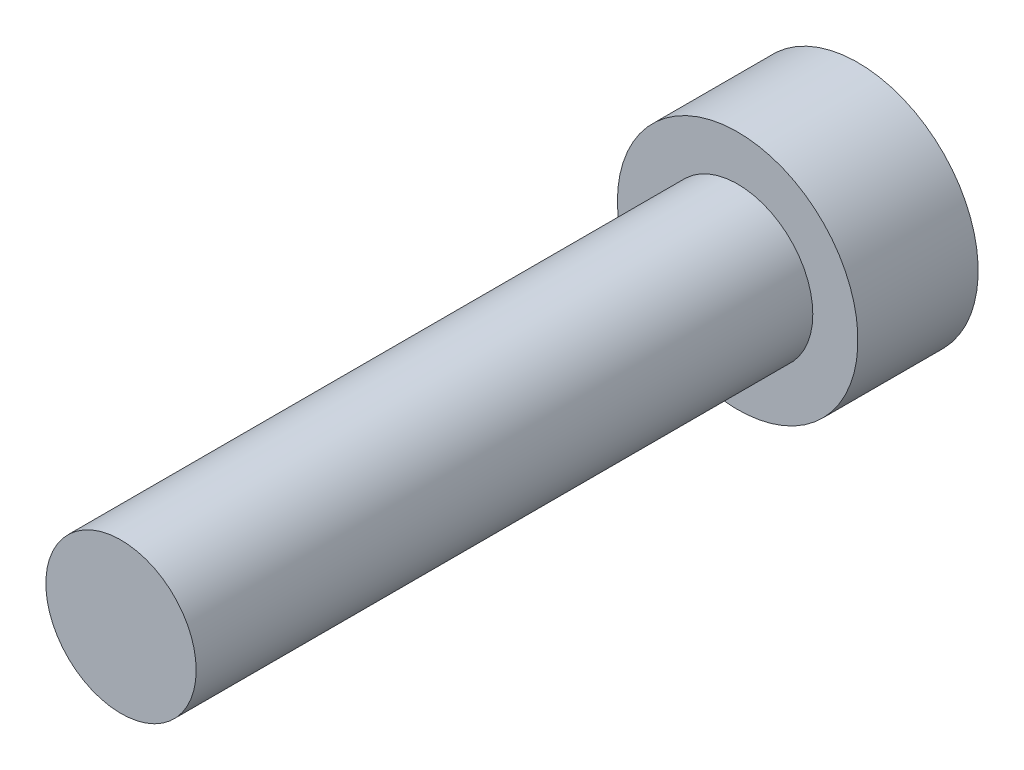
ISO-10303-21;
HEADER;
FILE_DESCRIPTION(('STEP AP214'),'2;1');
FILE_NAME('part.step','',(''),(''),'','','');
FILE_SCHEMA(('AUTOMOTIVE_DESIGN { 1 0 10303 214 1 1 1 1 }'));
ENDSEC;
DATA;
#1=APPLICATION_CONTEXT('core data for automotive mechanical design processes');
#2=APPLICATION_PROTOCOL_DEFINITION('international standard','automotive_design',2000,#1);
#3=PRODUCT_CONTEXT('',#1,'mechanical');
#4=PRODUCT('Part','Part','',(#3));
#5=PRODUCT_RELATED_PRODUCT_CATEGORY('part','',(#4));
#6=PRODUCT_DEFINITION_FORMATION('','',#4);
#7=PRODUCT_DEFINITION_CONTEXT('part definition',#1,'design');
#8=PRODUCT_DEFINITION('design','',#6,#7);
#9=PRODUCT_DEFINITION_SHAPE('','',#8);
#10=(LENGTH_UNIT() NAMED_UNIT(*) SI_UNIT(.MILLI.,.METRE.));
#11=(NAMED_UNIT(*) PLANE_ANGLE_UNIT() SI_UNIT($,.RADIAN.));
#12=(NAMED_UNIT(*) SI_UNIT($,.STERADIAN.) SOLID_ANGLE_UNIT());
#13=UNCERTAINTY_MEASURE_WITH_UNIT(LENGTH_MEASURE(1.E-05),#10,'distance_accuracy_value','');
#14=(GEOMETRIC_REPRESENTATION_CONTEXT(3) GLOBAL_UNCERTAINTY_ASSIGNED_CONTEXT((#13)) GLOBAL_UNIT_ASSIGNED_CONTEXT((#10,
#11,#12)) REPRESENTATION_CONTEXT('',''));
#15=CARTESIAN_POINT('',(0.,0.,0.));
#16=DIRECTION('',(0.,0.,1.));
#17=DIRECTION('',(1.,0.,0.));
#18=AXIS2_PLACEMENT_3D('',#15,#16,#17);
#19=CARTESIAN_POINT('',(0.,0.,20.51045));
#20=DIRECTION('',(0.,0.,-1.));
#21=DIRECTION('',(-1.,0.,0.));
#22=AXIS2_PLACEMENT_3D('',#19,#20,#21);
#23=CYLINDRICAL_SURFACE('',#22,2.5);
#24=CARTESIAN_POINT('',(0.,0.,20.51045));
#25=DIRECTION('',(0.,0.,1.));
#26=DIRECTION('',(1.,0.,0.));
#27=AXIS2_PLACEMENT_3D('',#24,#25,#26);
#28=CIRCLE('',#27,2.5);
#29=CARTESIAN_POINT('',(2.5,0.,20.51045));
#30=VERTEX_POINT('',#29);
#31=EDGE_CURVE('E11',#30,#30,#28,.T.);
#32=ORIENTED_EDGE('',*,*,#31,.F.);
#33=EDGE_LOOP('',(#32));
#34=FACE_BOUND('',#33,.T.);
#35=CARTESIAN_POINT('',(0.,0.,0.));
#36=DIRECTION('',(0.,0.,1.));
#37=DIRECTION('',(1.,0.,0.));
#38=AXIS2_PLACEMENT_3D('',#35,#36,#37);
#39=CIRCLE('',#38,2.5);
#40=CARTESIAN_POINT('',(2.5,0.,0.));
#41=VERTEX_POINT('',#40);
#42=EDGE_CURVE('E35',#41,#41,#39,.T.);
#43=ORIENTED_EDGE('',*,*,#42,.T.);
#44=EDGE_LOOP('',(#43));
#45=FACE_BOUND('',#44,.T.);
#46=ADVANCED_FACE('F32',(#34,#45),#23,.T.);
#47=CARTESIAN_POINT('',(0.,0.,20.51045));
#48=DIRECTION('',(0.,0.,1.));
#49=DIRECTION('',(1.,0.,0.));
#50=AXIS2_PLACEMENT_3D('',#47,#48,#49);
#51=PLANE('',#50);
#52=ORIENTED_EDGE('',*,*,#31,.T.);
#53=EDGE_LOOP('',(#52));
#54=FACE_BOUND('',#53,.T.);
#55=ADVANCED_FACE('F164',(#54),#51,.T.);
#56=CARTESIAN_POINT('',(0.,0.,-4.));
#57=DIRECTION('',(0.,0.,1.));
#58=DIRECTION('',(1.,0.,0.));
#59=AXIS2_PLACEMENT_3D('',#56,#57,#58);
#60=CYLINDRICAL_SURFACE('',#59,4.);
#61=CARTESIAN_POINT('',(0.,0.,-4.));
#62=DIRECTION('',(0.,0.,-1.));
#63=DIRECTION('',(-1.,0.,0.));
#64=AXIS2_PLACEMENT_3D('',#61,#62,#63);
#65=CIRCLE('',#64,4.);
#66=CARTESIAN_POINT('',(-4.,0.,-4.));
#67=VERTEX_POINT('',#66);
#68=EDGE_CURVE('E139',#67,#67,#65,.T.);
#69=ORIENTED_EDGE('',*,*,#68,.F.);
#70=EDGE_LOOP('',(#69));
#71=FACE_BOUND('',#70,.T.);
#72=CARTESIAN_POINT('',(0.,0.,0.));
#73=DIRECTION('',(0.,0.,-1.));
#74=DIRECTION('',(-1.,0.,0.));
#75=AXIS2_PLACEMENT_3D('',#72,#73,#74);
#76=CIRCLE('',#75,4.);
#77=CARTESIAN_POINT('',(-4.,0.,0.));
#78=VERTEX_POINT('',#77);
#79=EDGE_CURVE('E133',#78,#78,#76,.T.);
#80=ORIENTED_EDGE('',*,*,#79,.T.);
#81=EDGE_LOOP('',(#80));
#82=FACE_BOUND('',#81,.T.);
#83=ADVANCED_FACE('F145',(#71,#82),#60,.T.);
#84=CARTESIAN_POINT('',(0.,0.,-4.));
#85=DIRECTION('',(0.,0.,-1.));
#86=DIRECTION('',(-1.,0.,0.));
#87=AXIS2_PLACEMENT_3D('',#84,#85,#86);
#88=PLANE('',#87);
#89=DIRECTION('',(0.939522579874835,0.342486966037154,0.));
#90=VECTOR('',#89,1.);
#91=CARTESIAN_POINT('',(-2.60461337196572,2.18332587509689,-4.));
#92=LINE('',#91,#90);
#93=CARTESIAN_POINT('',(-2.60461337196572,2.18332587509689,-4.));
#94=VERTEX_POINT('',#93);
#95=CARTESIAN_POINT('',(0.588508986590941,3.3473242847074,-4.));
#96=VERTEX_POINT('',#95);
#97=EDGE_CURVE('E46',#94,#96,#92,.T.);
#98=ORIENTED_EDGE('',*,*,#97,.F.);
#99=DIRECTION('',(0.173158876884184,0.984893904619278,0.));
#100=VECTOR('',#99,1.);
#101=CARTESIAN_POINT('',(-3.19312235855666,-1.16399840961051,-4.));
#102=LINE('',#101,#100);
#103=CARTESIAN_POINT('',(-3.19312235855666,-1.16399840961051,-4.));
#104=VERTEX_POINT('',#103);
#105=EDGE_CURVE('E129',#104,#94,#102,.T.);
#106=ORIENTED_EDGE('',*,*,#105,.F.);
#107=DIRECTION('',(-0.766363702990651,0.642406938582124,0.));
#108=VECTOR('',#107,1.);
#109=CARTESIAN_POINT('',(-0.58850898659094,-3.34732428470741,-4.));
#110=LINE('',#109,#108);
#111=CARTESIAN_POINT('',(-0.58850898659094,-3.34732428470741,-4.));
#112=VERTEX_POINT('',#111);
#113=EDGE_CURVE('E127',#112,#104,#110,.T.);
#114=ORIENTED_EDGE('',*,*,#113,.F.);
#115=DIRECTION('',(-0.939522579874835,-0.342486966037155,0.));
#116=VECTOR('',#115,1.);
#117=CARTESIAN_POINT('',(2.60461337196572,-2.18332587509689,-4.));
#118=LINE('',#117,#116);
#119=CARTESIAN_POINT('',(2.60461337196572,-2.18332587509689,-4.));
#120=VERTEX_POINT('',#119);
#121=EDGE_CURVE('E94',#120,#112,#118,.T.);
#122=ORIENTED_EDGE('',*,*,#121,.F.);
#123=DIRECTION('',(-0.173158876884183,-0.984893904619279,0.));
#124=VECTOR('',#123,1.);
#125=CARTESIAN_POINT('',(3.19312235855666,1.16399840961051,-4.));
#126=LINE('',#125,#124);
#127=CARTESIAN_POINT('',(3.19312235855666,1.16399840961051,-4.));
#128=VERTEX_POINT('',#127);
#129=EDGE_CURVE('E123',#128,#120,#126,.T.);
#130=ORIENTED_EDGE('',*,*,#129,.F.);
#131=DIRECTION('',(0.766363702990651,-0.642406938582124,0.));
#132=VECTOR('',#131,1.);
#133=CARTESIAN_POINT('',(0.588508986590941,3.3473242847074,-4.));
#134=LINE('',#133,#132);
#135=EDGE_CURVE('E120',#96,#128,#134,.T.);
#136=ORIENTED_EDGE('',*,*,#135,.F.);
#137=EDGE_LOOP('',(#98,#106,#114,#122,#130,#136));
#138=FACE_BOUND('',#137,.T.);
#139=ORIENTED_EDGE('',*,*,#68,.T.);
#140=EDGE_LOOP('',(#139));
#141=FACE_BOUND('',#140,.T.);
#142=ADVANCED_FACE('F150',(#138,#141),#88,.T.);
#143=CARTESIAN_POINT('',(0.,0.,0.));
#144=DIRECTION('',(0.,0.,-1.));
#145=DIRECTION('',(-1.,0.,0.));
#146=AXIS2_PLACEMENT_3D('',#143,#144,#145);
#147=PLANE('',#146);
#148=ORIENTED_EDGE('',*,*,#42,.F.);
#149=EDGE_LOOP('',(#148));
#150=FACE_BOUND('',#149,.T.);
#151=ORIENTED_EDGE('',*,*,#79,.F.);
#152=EDGE_LOOP('',(#151));
#153=FACE_BOUND('',#152,.T.);
#154=ADVANCED_FACE('F147',(#150,#153),#147,.F.);
#155=CARTESIAN_POINT('',(-2.60461337196572,2.18332587509689,-2.));
#156=DIRECTION('',(-0.342486966037154,0.939522579874835,0.));
#157=DIRECTION('',(-0.939522579874835,-0.342486966037154,0.));
#158=AXIS2_PLACEMENT_3D('',#155,#156,#157);
#159=PLANE('',#158);
#160=ORIENTED_EDGE('',*,*,#97,.T.);
#161=DIRECTION('',(0.,0.,-1.));
#162=VECTOR('',#161,1.);
#163=CARTESIAN_POINT('',(0.588508986590941,3.3473242847074,-2.));
#164=LINE('',#163,#162);
#165=CARTESIAN_POINT('',(0.588508986590941,3.3473242847074,-2.));
#166=VERTEX_POINT('',#165);
#167=EDGE_CURVE('E76',#166,#96,#164,.T.);
#168=ORIENTED_EDGE('',*,*,#167,.F.);
#169=DIRECTION('',(0.939522579874835,0.342486966037154,0.));
#170=VECTOR('',#169,1.);
#171=CARTESIAN_POINT('',(-2.60461337196572,2.18332587509689,-2.));
#172=LINE('',#171,#170);
#173=CARTESIAN_POINT('',(-2.60461337196572,2.18332587509689,-2.));
#174=VERTEX_POINT('',#173);
#175=EDGE_CURVE('E131',#174,#166,#172,.T.);
#176=ORIENTED_EDGE('',*,*,#175,.F.);
#177=DIRECTION('',(0.,0.,-1.));
#178=VECTOR('',#177,1.);
#179=CARTESIAN_POINT('',(-2.60461337196572,2.18332587509689,-2.));
#180=LINE('',#179,#178);
#181=EDGE_CURVE('E54',#174,#94,#180,.T.);
#182=ORIENTED_EDGE('',*,*,#181,.T.);
#183=EDGE_LOOP('',(#160,#168,#176,#182));
#184=FACE_BOUND('',#183,.T.);
#185=ADVANCED_FACE('F149',(#184),#159,.F.);
#186=CARTESIAN_POINT('',(-3.19312235855666,-1.16399840961051,-2.));
#187=DIRECTION('',(-0.984893904619278,0.173158876884184,0.));
#188=DIRECTION('',(-0.173158876884184,-0.984893904619279,0.));
#189=AXIS2_PLACEMENT_3D('',#186,#187,#188);
#190=PLANE('',#189);
#191=ORIENTED_EDGE('',*,*,#105,.T.);
#192=ORIENTED_EDGE('',*,*,#181,.F.);
#193=DIRECTION('',(0.173158876884184,0.984893904619278,0.));
#194=VECTOR('',#193,1.);
#195=CARTESIAN_POINT('',(-3.19312235855666,-1.16399840961051,-2.));
#196=LINE('',#195,#194);
#197=CARTESIAN_POINT('',(-3.19312235855666,-1.16399840961051,-2.));
#198=VERTEX_POINT('',#197);
#199=EDGE_CURVE('E106',#198,#174,#196,.T.);
#200=ORIENTED_EDGE('',*,*,#199,.F.);
#201=DIRECTION('',(0.,0.,-1.));
#202=VECTOR('',#201,1.);
#203=CARTESIAN_POINT('',(-3.19312235855666,-1.16399840961051,-2.));
#204=LINE('',#203,#202);
#205=EDGE_CURVE('E98',#198,#104,#204,.T.);
#206=ORIENTED_EDGE('',*,*,#205,.T.);
#207=EDGE_LOOP('',(#191,#192,#200,#206));
#208=FACE_BOUND('',#207,.T.);
#209=ADVANCED_FACE('F157',(#208),#190,.F.);
#210=CARTESIAN_POINT('',(-0.58850898659094,-3.34732428470741,-2.));
#211=DIRECTION('',(-0.642406938582124,-0.766363702990651,0.));
#212=DIRECTION('',(0.766363702990651,-0.642406938582124,0.));
#213=AXIS2_PLACEMENT_3D('',#210,#211,#212);
#214=PLANE('',#213);
#215=ORIENTED_EDGE('',*,*,#113,.T.);
#216=ORIENTED_EDGE('',*,*,#205,.F.);
#217=DIRECTION('',(-0.766363702990651,0.642406938582124,0.));
#218=VECTOR('',#217,1.);
#219=CARTESIAN_POINT('',(-0.58850898659094,-3.34732428470741,-2.));
#220=LINE('',#219,#218);
#221=CARTESIAN_POINT('',(-0.58850898659094,-3.34732428470741,-2.));
#222=VERTEX_POINT('',#221);
#223=EDGE_CURVE('E102',#222,#198,#220,.T.);
#224=ORIENTED_EDGE('',*,*,#223,.F.);
#225=DIRECTION('',(0.,0.,-1.));
#226=VECTOR('',#225,1.);
#227=CARTESIAN_POINT('',(-0.58850898659094,-3.34732428470741,-2.));
#228=LINE('',#227,#226);
#229=EDGE_CURVE('E87',#222,#112,#228,.T.);
#230=ORIENTED_EDGE('',*,*,#229,.T.);
#231=EDGE_LOOP('',(#215,#216,#224,#230));
#232=FACE_BOUND('',#231,.T.);
#233=ADVANCED_FACE('F103',(#232),#214,.F.);
#234=CARTESIAN_POINT('',(2.60461337196572,-2.18332587509689,-2.));
#235=DIRECTION('',(0.342486966037155,-0.939522579874835,0.));
#236=DIRECTION('',(0.939522579874835,0.342486966037155,0.));
#237=AXIS2_PLACEMENT_3D('',#234,#235,#236);
#238=PLANE('',#237);
#239=ORIENTED_EDGE('',*,*,#121,.T.);
#240=ORIENTED_EDGE('',*,*,#229,.F.);
#241=DIRECTION('',(-0.939522579874835,-0.342486966037155,0.));
#242=VECTOR('',#241,1.);
#243=CARTESIAN_POINT('',(2.60461337196572,-2.18332587509689,-2.));
#244=LINE('',#243,#242);
#245=CARTESIAN_POINT('',(2.60461337196572,-2.18332587509689,-2.));
#246=VERTEX_POINT('',#245);
#247=EDGE_CURVE('E91',#246,#222,#244,.T.);
#248=ORIENTED_EDGE('',*,*,#247,.F.);
#249=DIRECTION('',(0.,0.,-1.));
#250=VECTOR('',#249,1.);
#251=CARTESIAN_POINT('',(2.60461337196572,-2.18332587509689,-2.));
#252=LINE('',#251,#250);
#253=EDGE_CURVE('E99',#246,#120,#252,.T.);
#254=ORIENTED_EDGE('',*,*,#253,.T.);
#255=EDGE_LOOP('',(#239,#240,#248,#254));
#256=FACE_BOUND('',#255,.T.);
#257=ADVANCED_FACE('F89',(#256),#238,.F.);
#258=CARTESIAN_POINT('',(3.19312235855666,1.16399840961051,-2.));
#259=DIRECTION('',(0.984893904619279,-0.173158876884183,0.));
#260=DIRECTION('',(0.173158876884183,0.984893904619279,0.));
#261=AXIS2_PLACEMENT_3D('',#258,#259,#260);
#262=PLANE('',#261);
#263=ORIENTED_EDGE('',*,*,#129,.T.);
#264=ORIENTED_EDGE('',*,*,#253,.F.);
#265=DIRECTION('',(-0.173158876884183,-0.984893904619279,0.));
#266=VECTOR('',#265,1.);
#267=CARTESIAN_POINT('',(3.19312235855666,1.16399840961051,-2.));
#268=LINE('',#267,#266);
#269=CARTESIAN_POINT('',(3.19312235855666,1.16399840961051,-2.));
#270=VERTEX_POINT('',#269);
#271=EDGE_CURVE('E112',#270,#246,#268,.T.);
#272=ORIENTED_EDGE('',*,*,#271,.F.);
#273=DIRECTION('',(0.,0.,-1.));
#274=VECTOR('',#273,1.);
#275=CARTESIAN_POINT('',(3.19312235855666,1.16399840961051,-2.));
#276=LINE('',#275,#274);
#277=EDGE_CURVE('E136',#270,#128,#276,.T.);
#278=ORIENTED_EDGE('',*,*,#277,.T.);
#279=EDGE_LOOP('',(#263,#264,#272,#278));
#280=FACE_BOUND('',#279,.T.);
#281=ADVANCED_FACE('F218',(#280),#262,.F.);
#282=CARTESIAN_POINT('',(0.588508986590941,3.3473242847074,-2.));
#283=DIRECTION('',(0.642406938582124,0.766363702990651,0.));
#284=DIRECTION('',(-0.766363702990651,0.642406938582124,0.));
#285=AXIS2_PLACEMENT_3D('',#282,#283,#284);
#286=PLANE('',#285);
#287=ORIENTED_EDGE('',*,*,#135,.T.);
#288=ORIENTED_EDGE('',*,*,#277,.F.);
#289=DIRECTION('',(0.766363702990651,-0.642406938582124,0.));
#290=VECTOR('',#289,1.);
#291=CARTESIAN_POINT('',(0.588508986590941,3.3473242847074,-2.));
#292=LINE('',#291,#290);
#293=EDGE_CURVE('E114',#166,#270,#292,.T.);
#294=ORIENTED_EDGE('',*,*,#293,.F.);
#295=ORIENTED_EDGE('',*,*,#167,.T.);
#296=EDGE_LOOP('',(#287,#288,#294,#295));
#297=FACE_BOUND('',#296,.T.);
#298=ADVANCED_FACE('F227',(#297),#286,.F.);
#299=CARTESIAN_POINT('',(0.,0.,-2.));
#300=DIRECTION('',(0.,0.,-1.));
#301=DIRECTION('',(-1.,0.,0.));
#302=AXIS2_PLACEMENT_3D('',#299,#300,#301);
#303=PLANE('',#302);
#304=ORIENTED_EDGE('',*,*,#175,.T.);
#305=ORIENTED_EDGE('',*,*,#293,.T.);
#306=ORIENTED_EDGE('',*,*,#271,.T.);
#307=ORIENTED_EDGE('',*,*,#247,.T.);
#308=ORIENTED_EDGE('',*,*,#223,.T.);
#309=ORIENTED_EDGE('',*,*,#199,.T.);
#310=EDGE_LOOP('',(#304,#305,#306,#307,#308,#309));
#311=FACE_BOUND('',#310,.T.);
#312=ADVANCED_FACE('F109',(#311),#303,.T.);
#313=CLOSED_SHELL('',(#46,#55,#83,#142,#154,#185,#209,#233,#257,#281,#298,#312));
#314=MANIFOLD_SOLID_BREP('B2',#313);
#315=ADVANCED_BREP_SHAPE_REPRESENTATION('',(#18,#314),#14);
#316=SHAPE_DEFINITION_REPRESENTATION(#9,#315);
ENDSEC;
END-ISO-10303-21;
